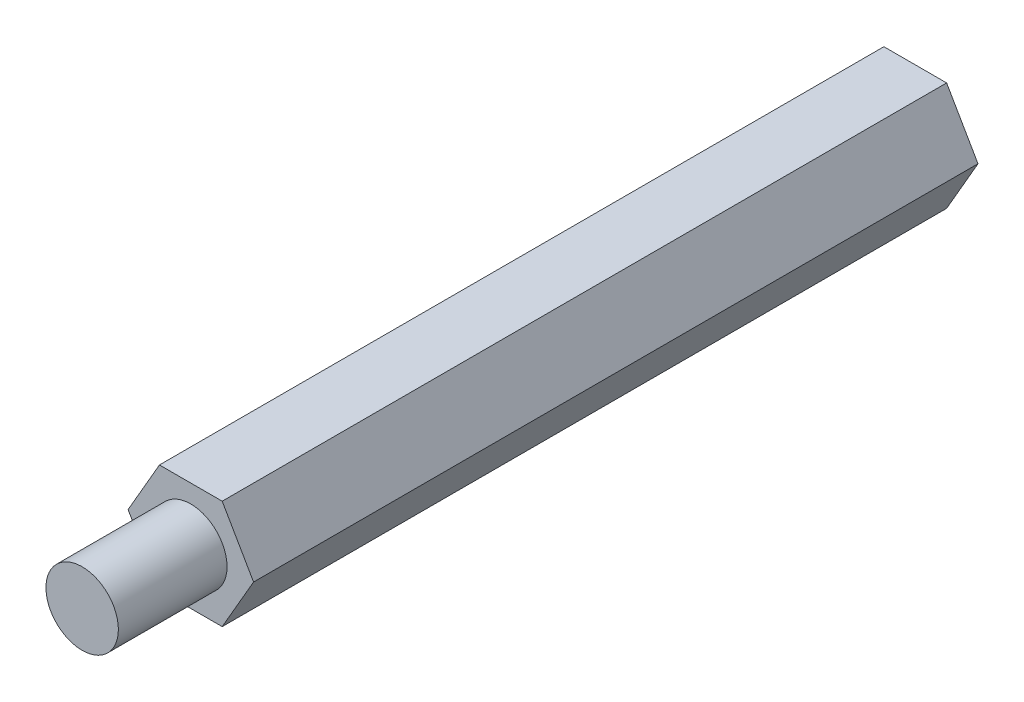
ISO-10303-21;
HEADER;
FILE_DESCRIPTION(('STEP AP214'),'2;1');
FILE_NAME('part.step','',(''),(''),'','','');
FILE_SCHEMA(('AUTOMOTIVE_DESIGN { 1 0 10303 214 1 1 1 1 }'));
ENDSEC;
DATA;
#1=APPLICATION_CONTEXT('core data for automotive mechanical design processes');
#2=APPLICATION_PROTOCOL_DEFINITION('international standard','automotive_design',2000,#1);
#3=PRODUCT_CONTEXT('',#1,'mechanical');
#4=PRODUCT('Part','Part','',(#3));
#5=PRODUCT_RELATED_PRODUCT_CATEGORY('part','',(#4));
#6=PRODUCT_DEFINITION_FORMATION('','',#4);
#7=PRODUCT_DEFINITION_CONTEXT('part definition',#1,'design');
#8=PRODUCT_DEFINITION('design','',#6,#7);
#9=PRODUCT_DEFINITION_SHAPE('','',#8);
#10=(LENGTH_UNIT() NAMED_UNIT(*) SI_UNIT(.MILLI.,.METRE.));
#11=(NAMED_UNIT(*) PLANE_ANGLE_UNIT() SI_UNIT($,.RADIAN.));
#12=(NAMED_UNIT(*) SI_UNIT($,.STERADIAN.) SOLID_ANGLE_UNIT());
#13=UNCERTAINTY_MEASURE_WITH_UNIT(LENGTH_MEASURE(1.E-05),#10,'distance_accuracy_value','');
#14=(GEOMETRIC_REPRESENTATION_CONTEXT(3) GLOBAL_UNCERTAINTY_ASSIGNED_CONTEXT((#13)) GLOBAL_UNIT_ASSIGNED_CONTEXT((#10,
#11,#12)) REPRESENTATION_CONTEXT('',''));
#15=CARTESIAN_POINT('',(0.,0.,0.));
#16=DIRECTION('',(0.,0.,1.));
#17=DIRECTION('',(1.,0.,0.));
#18=AXIS2_PLACEMENT_3D('',#15,#16,#17);
#19=CARTESIAN_POINT('',(-0.866025403784438,-1.5,20.));
#20=DIRECTION('',(0.,1.,0.));
#21=DIRECTION('',(-1.,0.,0.));
#22=AXIS2_PLACEMENT_3D('',#19,#20,#21);
#23=PLANE('',#22);
#24=DIRECTION('',(1.,0.,0.));
#25=VECTOR('',#24,1.);
#26=CARTESIAN_POINT('',(-0.866025403784438,-1.5,0.));
#27=LINE('',#26,#25);
#28=CARTESIAN_POINT('',(-0.866025403784438,-1.5,0.));
#29=VERTEX_POINT('',#28);
#30=CARTESIAN_POINT('',(0.866025403784439,-1.5,0.));
#31=VERTEX_POINT('',#30);
#32=EDGE_CURVE('E121',#29,#31,#27,.T.);
#33=ORIENTED_EDGE('',*,*,#32,.T.);
#34=DIRECTION('',(0.,0.,-1.));
#35=VECTOR('',#34,1.);
#36=CARTESIAN_POINT('',(0.866025403784439,-1.5,20.));
#37=LINE('',#36,#35);
#38=CARTESIAN_POINT('',(0.866025403784439,-1.5,20.));
#39=VERTEX_POINT('',#38);
#40=EDGE_CURVE('E36',#39,#31,#37,.T.);
#41=ORIENTED_EDGE('',*,*,#40,.F.);
#42=DIRECTION('',(1.,0.,0.));
#43=VECTOR('',#42,1.);
#44=CARTESIAN_POINT('',(-0.866025403784438,-1.5,20.));
#45=LINE('',#44,#43);
#46=CARTESIAN_POINT('',(-0.866025403784438,-1.5,20.));
#47=VERTEX_POINT('',#46);
#48=EDGE_CURVE('E132',#47,#39,#45,.T.);
#49=ORIENTED_EDGE('',*,*,#48,.F.);
#50=DIRECTION('',(0.,0.,-1.));
#51=VECTOR('',#50,1.);
#52=CARTESIAN_POINT('',(-0.866025403784438,-1.5,20.));
#53=LINE('',#52,#51);
#54=EDGE_CURVE('E117',#47,#29,#53,.T.);
#55=ORIENTED_EDGE('',*,*,#54,.T.);
#56=EDGE_LOOP('',(#33,#41,#49,#55));
#57=FACE_BOUND('',#56,.T.);
#58=ADVANCED_FACE('F33',(#57),#23,.F.);
#59=CARTESIAN_POINT('',(0.866025403784439,-1.5,20.));
#60=DIRECTION('',(-0.866025403784439,0.5,0.));
#61=DIRECTION('',(-0.5,-0.866025403784439,0.));
#62=AXIS2_PLACEMENT_3D('',#59,#60,#61);
#63=PLANE('',#62);
#64=DIRECTION('',(0.5,0.866025403784439,0.));
#65=VECTOR('',#64,1.);
#66=CARTESIAN_POINT('',(0.866025403784439,-1.5,0.));
#67=LINE('',#66,#65);
#68=CARTESIAN_POINT('',(1.73205080756888,0.,0.));
#69=VERTEX_POINT('',#68);
#70=EDGE_CURVE('E124',#31,#69,#67,.T.);
#71=ORIENTED_EDGE('',*,*,#70,.T.);
#72=DIRECTION('',(0.,0.,-1.));
#73=VECTOR('',#72,1.);
#74=CARTESIAN_POINT('',(1.73205080756888,0.,20.));
#75=LINE('',#74,#73);
#76=CARTESIAN_POINT('',(1.73205080756888,0.,20.));
#77=VERTEX_POINT('',#76);
#78=EDGE_CURVE('E135',#77,#69,#75,.T.);
#79=ORIENTED_EDGE('',*,*,#78,.F.);
#80=DIRECTION('',(0.5,0.866025403784439,0.));
#81=VECTOR('',#80,1.);
#82=CARTESIAN_POINT('',(0.866025403784439,-1.5,20.));
#83=LINE('',#82,#81);
#84=EDGE_CURVE('E89',#39,#77,#83,.T.);
#85=ORIENTED_EDGE('',*,*,#84,.F.);
#86=ORIENTED_EDGE('',*,*,#40,.T.);
#87=EDGE_LOOP('',(#71,#79,#85,#86));
#88=FACE_BOUND('',#87,.T.);
#89=ADVANCED_FACE('F140',(#88),#63,.F.);
#90=CARTESIAN_POINT('',(1.73205080756888,0.,20.));
#91=DIRECTION('',(-0.866025403784439,-0.5,0.));
#92=DIRECTION('',(0.5,-0.866025403784439,0.));
#93=AXIS2_PLACEMENT_3D('',#90,#91,#92);
#94=PLANE('',#93);
#95=DIRECTION('',(-0.5,0.866025403784439,0.));
#96=VECTOR('',#95,1.);
#97=CARTESIAN_POINT('',(1.73205080756888,0.,0.));
#98=LINE('',#97,#96);
#99=CARTESIAN_POINT('',(0.866025403784439,1.5,0.));
#100=VERTEX_POINT('',#99);
#101=EDGE_CURVE('E127',#69,#100,#98,.T.);
#102=ORIENTED_EDGE('',*,*,#101,.T.);
#103=DIRECTION('',(0.,0.,-1.));
#104=VECTOR('',#103,1.);
#105=CARTESIAN_POINT('',(0.866025403784439,1.5,20.));
#106=LINE('',#105,#104);
#107=CARTESIAN_POINT('',(0.866025403784439,1.5,20.));
#108=VERTEX_POINT('',#107);
#109=EDGE_CURVE('E112',#108,#100,#106,.T.);
#110=ORIENTED_EDGE('',*,*,#109,.F.);
#111=DIRECTION('',(-0.5,0.866025403784439,0.));
#112=VECTOR('',#111,1.);
#113=CARTESIAN_POINT('',(1.73205080756888,0.,20.));
#114=LINE('',#113,#112);
#115=EDGE_CURVE('E103',#77,#108,#114,.T.);
#116=ORIENTED_EDGE('',*,*,#115,.F.);
#117=ORIENTED_EDGE('',*,*,#78,.T.);
#118=EDGE_LOOP('',(#102,#110,#116,#117));
#119=FACE_BOUND('',#118,.T.);
#120=ADVANCED_FACE('F146',(#119),#94,.F.);
#121=CARTESIAN_POINT('',(0.866025403784439,1.5,20.));
#122=DIRECTION('',(0.,-1.,0.));
#123=DIRECTION('',(0.,0.,-1.));
#124=AXIS2_PLACEMENT_3D('',#121,#122,#123);
#125=PLANE('',#124);
#126=DIRECTION('',(-1.,0.,0.));
#127=VECTOR('',#126,1.);
#128=CARTESIAN_POINT('',(0.866025403784439,1.5,0.));
#129=LINE('',#128,#127);
#130=CARTESIAN_POINT('',(-0.866025403784439,1.5,0.));
#131=VERTEX_POINT('',#130);
#132=EDGE_CURVE('E111',#100,#131,#129,.T.);
#133=ORIENTED_EDGE('',*,*,#132,.T.);
#134=DIRECTION('',(0.,0.,-1.));
#135=VECTOR('',#134,1.);
#136=CARTESIAN_POINT('',(-0.866025403784439,1.5,20.));
#137=LINE('',#136,#135);
#138=CARTESIAN_POINT('',(-0.866025403784439,1.5,20.));
#139=VERTEX_POINT('',#138);
#140=EDGE_CURVE('E108',#139,#131,#137,.T.);
#141=ORIENTED_EDGE('',*,*,#140,.F.);
#142=DIRECTION('',(-1.,0.,0.));
#143=VECTOR('',#142,1.);
#144=CARTESIAN_POINT('',(0.866025403784439,1.5,20.));
#145=LINE('',#144,#143);
#146=EDGE_CURVE('E97',#108,#139,#145,.T.);
#147=ORIENTED_EDGE('',*,*,#146,.F.);
#148=ORIENTED_EDGE('',*,*,#109,.T.);
#149=EDGE_LOOP('',(#133,#141,#147,#148));
#150=FACE_BOUND('',#149,.T.);
#151=ADVANCED_FACE('F109',(#150),#125,.F.);
#152=CARTESIAN_POINT('',(-0.866025403784439,1.5,20.));
#153=DIRECTION('',(0.866025403784439,-0.5,0.));
#154=DIRECTION('',(0.5,0.866025403784439,0.));
#155=AXIS2_PLACEMENT_3D('',#152,#153,#154);
#156=PLANE('',#155);
#157=DIRECTION('',(-0.5,-0.866025403784439,0.));
#158=VECTOR('',#157,1.);
#159=CARTESIAN_POINT('',(-0.866025403784439,1.5,0.));
#160=LINE('',#159,#158);
#161=CARTESIAN_POINT('',(-1.73205080756888,0.,0.));
#162=VERTEX_POINT('',#161);
#163=EDGE_CURVE('E74',#131,#162,#160,.T.);
#164=ORIENTED_EDGE('',*,*,#163,.T.);
#165=DIRECTION('',(0.,0.,-1.));
#166=VECTOR('',#165,1.);
#167=CARTESIAN_POINT('',(-1.73205080756888,0.,20.));
#168=LINE('',#167,#166);
#169=CARTESIAN_POINT('',(-1.73205080756888,0.,20.));
#170=VERTEX_POINT('',#169);
#171=EDGE_CURVE('E113',#170,#162,#168,.T.);
#172=ORIENTED_EDGE('',*,*,#171,.F.);
#173=DIRECTION('',(-0.5,-0.866025403784439,0.));
#174=VECTOR('',#173,1.);
#175=CARTESIAN_POINT('',(-0.866025403784439,1.5,20.));
#176=LINE('',#175,#174);
#177=EDGE_CURVE('E101',#139,#170,#176,.T.);
#178=ORIENTED_EDGE('',*,*,#177,.F.);
#179=ORIENTED_EDGE('',*,*,#140,.T.);
#180=EDGE_LOOP('',(#164,#172,#178,#179));
#181=FACE_BOUND('',#180,.T.);
#182=ADVANCED_FACE('F115',(#181),#156,.F.);
#183=CARTESIAN_POINT('',(-1.73205080756888,0.,20.));
#184=DIRECTION('',(0.866025403784439,0.5,0.));
#185=DIRECTION('',(-0.5,0.866025403784439,0.));
#186=AXIS2_PLACEMENT_3D('',#183,#184,#185);
#187=PLANE('',#186);
#188=DIRECTION('',(0.5,-0.866025403784439,0.));
#189=VECTOR('',#188,1.);
#190=CARTESIAN_POINT('',(-1.73205080756888,0.,0.));
#191=LINE('',#190,#189);
#192=EDGE_CURVE('E80',#162,#29,#191,.T.);
#193=ORIENTED_EDGE('',*,*,#192,.T.);
#194=ORIENTED_EDGE('',*,*,#54,.F.);
#195=DIRECTION('',(0.5,-0.866025403784439,0.));
#196=VECTOR('',#195,1.);
#197=CARTESIAN_POINT('',(-1.73205080756888,0.,20.));
#198=LINE('',#197,#196);
#199=EDGE_CURVE('E50',#170,#47,#198,.T.);
#200=ORIENTED_EDGE('',*,*,#199,.F.);
#201=ORIENTED_EDGE('',*,*,#171,.T.);
#202=EDGE_LOOP('',(#193,#194,#200,#201));
#203=FACE_BOUND('',#202,.T.);
#204=ADVANCED_FACE('F171',(#203),#187,.F.);
#205=CARTESIAN_POINT('',(0.,0.,20.));
#206=DIRECTION('',(0.,0.,1.));
#207=DIRECTION('',(1.,0.,0.));
#208=AXIS2_PLACEMENT_3D('',#205,#206,#207);
#209=PLANE('',#208);
#210=CARTESIAN_POINT('',(0.,0.,20.));
#211=DIRECTION('',(0.,0.,1.));
#212=DIRECTION('',(1.,0.,0.));
#213=AXIS2_PLACEMENT_3D('',#210,#211,#212);
#214=CIRCLE('',#213,1.);
#215=CARTESIAN_POINT('',(1.,0.,20.));
#216=VERTEX_POINT('',#215);
#217=EDGE_CURVE('E11',#216,#216,#214,.T.);
#218=ORIENTED_EDGE('',*,*,#217,.F.);
#219=EDGE_LOOP('',(#218));
#220=FACE_BOUND('',#219,.T.);
#221=ORIENTED_EDGE('',*,*,#48,.T.);
#222=ORIENTED_EDGE('',*,*,#84,.T.);
#223=ORIENTED_EDGE('',*,*,#115,.T.);
#224=ORIENTED_EDGE('',*,*,#146,.T.);
#225=ORIENTED_EDGE('',*,*,#177,.T.);
#226=ORIENTED_EDGE('',*,*,#199,.T.);
#227=EDGE_LOOP('',(#221,#222,#223,#224,#225,#226));
#228=FACE_BOUND('',#227,.T.);
#229=ADVANCED_FACE('F99',(#220,#228),#209,.T.);
#230=CARTESIAN_POINT('',(0.,0.,0.));
#231=DIRECTION('',(0.,0.,1.));
#232=DIRECTION('',(1.,0.,0.));
#233=AXIS2_PLACEMENT_3D('',#230,#231,#232);
#234=PLANE('',#233);
#235=CARTESIAN_POINT('',(0.,0.,0.));
#236=DIRECTION('',(0.,0.,-1.));
#237=DIRECTION('',(-1.,0.,0.));
#238=AXIS2_PLACEMENT_3D('',#235,#236,#237);
#239=CIRCLE('',#238,1.19999999999999);
#240=CARTESIAN_POINT('',(-1.19999999999999,0.,0.));
#241=VERTEX_POINT('',#240);
#242=EDGE_CURVE('E155',#241,#241,#239,.T.);
#243=ORIENTED_EDGE('',*,*,#242,.F.);
#244=EDGE_LOOP('',(#243));
#245=FACE_BOUND('',#244,.T.);
#246=ORIENTED_EDGE('',*,*,#32,.F.);
#247=ORIENTED_EDGE('',*,*,#192,.F.);
#248=ORIENTED_EDGE('',*,*,#163,.F.);
#249=ORIENTED_EDGE('',*,*,#132,.F.);
#250=ORIENTED_EDGE('',*,*,#101,.F.);
#251=ORIENTED_EDGE('',*,*,#70,.F.);
#252=EDGE_LOOP('',(#246,#247,#248,#249,#250,#251));
#253=FACE_BOUND('',#252,.T.);
#254=ADVANCED_FACE('F145',(#245,#253),#234,.F.);
#255=CARTESIAN_POINT('',(0.,0.,23.));
#256=DIRECTION('',(0.,0.,-1.));
#257=DIRECTION('',(-1.,0.,0.));
#258=AXIS2_PLACEMENT_3D('',#255,#256,#257);
#259=CYLINDRICAL_SURFACE('',#258,1.);
#260=CARTESIAN_POINT('',(0.,0.,23.));
#261=DIRECTION('',(0.,0.,1.));
#262=DIRECTION('',(1.,0.,0.));
#263=AXIS2_PLACEMENT_3D('',#260,#261,#262);
#264=CIRCLE('',#263,1.);
#265=CARTESIAN_POINT('',(1.,0.,23.));
#266=VERTEX_POINT('',#265);
#267=EDGE_CURVE('E125',#266,#266,#264,.T.);
#268=ORIENTED_EDGE('',*,*,#267,.F.);
#269=EDGE_LOOP('',(#268));
#270=FACE_BOUND('',#269,.T.);
#271=ORIENTED_EDGE('',*,*,#217,.T.);
#272=EDGE_LOOP('',(#271));
#273=FACE_BOUND('',#272,.T.);
#274=ADVANCED_FACE('F162',(#270,#273),#259,.T.);
#275=CARTESIAN_POINT('',(0.,0.,23.));
#276=DIRECTION('',(0.,0.,1.));
#277=DIRECTION('',(1.,0.,0.));
#278=AXIS2_PLACEMENT_3D('',#275,#276,#277);
#279=PLANE('',#278);
#280=ORIENTED_EDGE('',*,*,#267,.T.);
#281=EDGE_LOOP('',(#280));
#282=FACE_BOUND('',#281,.T.);
#283=ADVANCED_FACE('F168',(#282),#279,.T.);
#284=CARTESIAN_POINT('',(0.,0.,3.));
#285=DIRECTION('',(0.,0.,-1.));
#286=DIRECTION('',(-1.,0.,0.));
#287=AXIS2_PLACEMENT_3D('',#284,#285,#286);
#288=CONICAL_SURFACE('',#287,1.2,1.02974425867665);
#289=CARTESIAN_POINT('',(0.,0.,3.72103274283307));
#290=VERTEX_POINT('',#289);
#291=VERTEX_LOOP('',#290);
#292=FACE_BOUND('',#291,.T.);
#293=CARTESIAN_POINT('',(0.,0.,3.));
#294=DIRECTION('',(0.,0.,-1.));
#295=DIRECTION('',(-1.,0.,0.));
#296=AXIS2_PLACEMENT_3D('',#293,#294,#295);
#297=CIRCLE('',#296,1.2);
#298=CARTESIAN_POINT('',(-1.2,0.,3.));
#299=VERTEX_POINT('',#298);
#300=EDGE_CURVE('E152',#299,#299,#297,.T.);
#301=ORIENTED_EDGE('',*,*,#300,.T.);
#302=EDGE_LOOP('',(#301));
#303=FACE_BOUND('',#302,.T.);
#304=ADVANCED_FACE('F211',(#292,#303),#288,.F.);
#305=CARTESIAN_POINT('',(0.,0.,0.));
#306=DIRECTION('',(0.,0.,-1.));
#307=DIRECTION('',(-1.,0.,0.));
#308=AXIS2_PLACEMENT_3D('',#305,#306,#307);
#309=CYLINDRICAL_SURFACE('',#308,1.19999999999999);
#310=ORIENTED_EDGE('',*,*,#300,.F.);
#311=EDGE_LOOP('',(#310));
#312=FACE_BOUND('',#311,.T.);
#313=ORIENTED_EDGE('',*,*,#242,.T.);
#314=EDGE_LOOP('',(#313));
#315=FACE_BOUND('',#314,.T.);
#316=ADVANCED_FACE('F159',(#312,#315),#309,.F.);
#317=CLOSED_SHELL('',(#58,#89,#120,#151,#182,#204,#229,#254,#274,#283,#304,#316));
#318=MANIFOLD_SOLID_BREP('B2',#317);
#319=ADVANCED_BREP_SHAPE_REPRESENTATION('',(#18,#318),#14);
#320=SHAPE_DEFINITION_REPRESENTATION(#9,#319);
ENDSEC;
END-ISO-10303-21;
